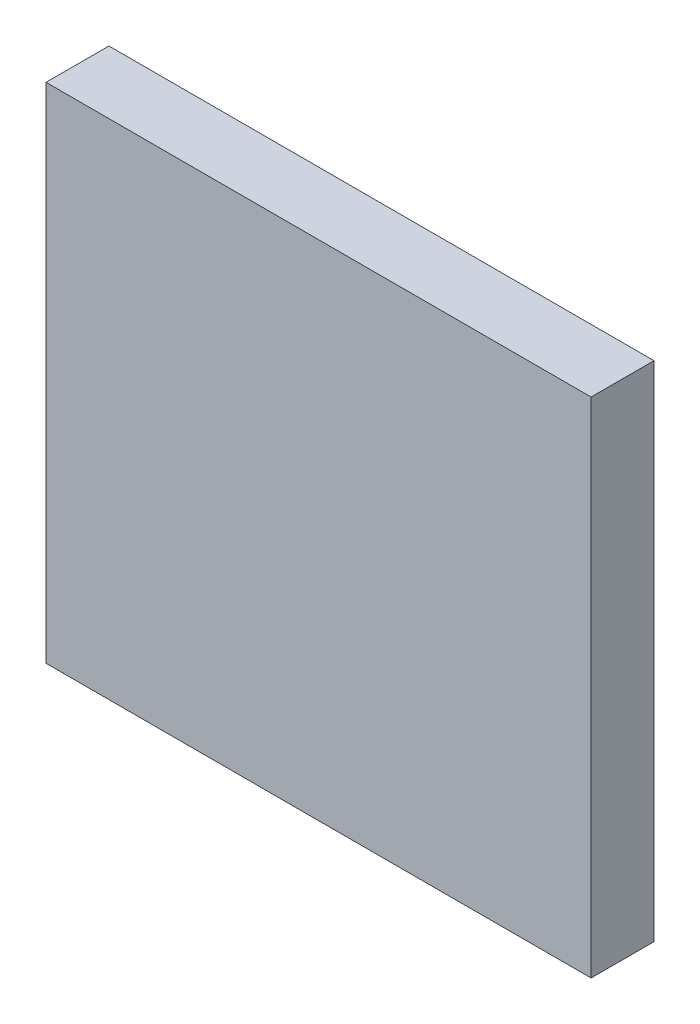
ISO-10303-21;
HEADER;
FILE_DESCRIPTION(('STEP AP214'),'2;1');
FILE_NAME('part.step','',(''),(''),'','','');
FILE_SCHEMA(('AUTOMOTIVE_DESIGN { 1 0 10303 214 1 1 1 1 }'));
ENDSEC;
DATA;
#1=APPLICATION_CONTEXT('core data for automotive mechanical design processes');
#2=APPLICATION_PROTOCOL_DEFINITION('international standard','automotive_design',2000,#1);
#3=PRODUCT_CONTEXT('',#1,'mechanical');
#4=PRODUCT('Part','Part','',(#3));
#5=PRODUCT_RELATED_PRODUCT_CATEGORY('part','',(#4));
#6=PRODUCT_DEFINITION_FORMATION('','',#4);
#7=PRODUCT_DEFINITION_CONTEXT('part definition',#1,'design');
#8=PRODUCT_DEFINITION('design','',#6,#7);
#9=PRODUCT_DEFINITION_SHAPE('','',#8);
#10=(LENGTH_UNIT() NAMED_UNIT(*) SI_UNIT(.MILLI.,.METRE.));
#11=(NAMED_UNIT(*) PLANE_ANGLE_UNIT() SI_UNIT($,.RADIAN.));
#12=(NAMED_UNIT(*) SI_UNIT($,.STERADIAN.) SOLID_ANGLE_UNIT());
#13=UNCERTAINTY_MEASURE_WITH_UNIT(LENGTH_MEASURE(1.E-05),#10,'distance_accuracy_value','');
#14=(GEOMETRIC_REPRESENTATION_CONTEXT(3) GLOBAL_UNCERTAINTY_ASSIGNED_CONTEXT((#13)) GLOBAL_UNIT_ASSIGNED_CONTEXT((#10,
#11,#12)) REPRESENTATION_CONTEXT('',''));
#15=CARTESIAN_POINT('',(0.,0.,0.));
#16=DIRECTION('',(0.,0.,1.));
#17=DIRECTION('',(1.,0.,0.));
#18=AXIS2_PLACEMENT_3D('',#15,#16,#17);
#19=CARTESIAN_POINT('',(13.,-12.,3.));
#20=DIRECTION('',(-1.,0.,0.));
#21=DIRECTION('',(0.,0.,1.));
#22=AXIS2_PLACEMENT_3D('',#19,#20,#21);
#23=PLANE('',#22);
#24=DIRECTION('',(0.,1.,0.));
#25=VECTOR('',#24,1.);
#26=CARTESIAN_POINT('',(13.,-12.,0.));
#27=LINE('',#26,#25);
#28=CARTESIAN_POINT('',(13.,-12.,0.));
#29=VERTEX_POINT('',#28);
#30=CARTESIAN_POINT('',(13.,12.,0.));
#31=VERTEX_POINT('',#30);
#32=EDGE_CURVE('E96',#29,#31,#27,.T.);
#33=ORIENTED_EDGE('',*,*,#32,.T.);
#34=DIRECTION('',(0.,0.,-1.));
#35=VECTOR('',#34,1.);
#36=CARTESIAN_POINT('',(13.,12.,3.));
#37=LINE('',#36,#35);
#38=CARTESIAN_POINT('',(13.,12.,3.));
#39=VERTEX_POINT('',#38);
#40=EDGE_CURVE('E11',#39,#31,#37,.T.);
#41=ORIENTED_EDGE('',*,*,#40,.F.);
#42=DIRECTION('',(0.,1.,0.));
#43=VECTOR('',#42,1.);
#44=CARTESIAN_POINT('',(13.,-12.,3.));
#45=LINE('',#44,#43);
#46=CARTESIAN_POINT('',(13.,-12.,3.));
#47=VERTEX_POINT('',#46);
#48=EDGE_CURVE('E84',#47,#39,#45,.T.);
#49=ORIENTED_EDGE('',*,*,#48,.F.);
#50=DIRECTION('',(0.,0.,-1.));
#51=VECTOR('',#50,1.);
#52=CARTESIAN_POINT('',(13.,-12.,3.));
#53=LINE('',#52,#51);
#54=EDGE_CURVE('E92',#47,#29,#53,.T.);
#55=ORIENTED_EDGE('',*,*,#54,.T.);
#56=EDGE_LOOP('',(#33,#41,#49,#55));
#57=FACE_BOUND('',#56,.T.);
#58=ADVANCED_FACE('F33',(#57),#23,.F.);
#59=CARTESIAN_POINT('',(-13.,12.,3.));
#60=DIRECTION('',(0.,-1.,0.));
#61=DIRECTION('',(0.,0.,-1.));
#62=AXIS2_PLACEMENT_3D('',#59,#60,#61);
#63=PLANE('',#62);
#64=DIRECTION('',(-1.,0.,0.));
#65=VECTOR('',#64,1.);
#66=CARTESIAN_POINT('',(-13.,12.,0.));
#67=LINE('',#66,#65);
#68=CARTESIAN_POINT('',(-13.,12.,0.));
#69=VERTEX_POINT('',#68);
#70=EDGE_CURVE('E88',#31,#69,#67,.T.);
#71=ORIENTED_EDGE('',*,*,#70,.T.);
#72=DIRECTION('',(0.,0.,-1.));
#73=VECTOR('',#72,1.);
#74=CARTESIAN_POINT('',(-13.,12.,3.));
#75=LINE('',#74,#73);
#76=CARTESIAN_POINT('',(-13.,12.,3.));
#77=VERTEX_POINT('',#76);
#78=EDGE_CURVE('E41',#77,#69,#75,.T.);
#79=ORIENTED_EDGE('',*,*,#78,.F.);
#80=DIRECTION('',(-1.,0.,0.));
#81=VECTOR('',#80,1.);
#82=CARTESIAN_POINT('',(-13.,12.,3.));
#83=LINE('',#82,#81);
#84=EDGE_CURVE('E79',#39,#77,#83,.T.);
#85=ORIENTED_EDGE('',*,*,#84,.F.);
#86=ORIENTED_EDGE('',*,*,#40,.T.);
#87=EDGE_LOOP('',(#71,#79,#85,#86));
#88=FACE_BOUND('',#87,.T.);
#89=ADVANCED_FACE('F87',(#88),#63,.F.);
#90=CARTESIAN_POINT('',(-13.,-12.,3.));
#91=DIRECTION('',(1.,0.,0.));
#92=DIRECTION('',(0.,0.,-1.));
#93=AXIS2_PLACEMENT_3D('',#90,#91,#92);
#94=PLANE('',#93);
#95=DIRECTION('',(0.,-1.,0.));
#96=VECTOR('',#95,1.);
#97=CARTESIAN_POINT('',(-13.,-12.,0.));
#98=LINE('',#97,#96);
#99=CARTESIAN_POINT('',(-13.,-12.,0.));
#100=VERTEX_POINT('',#99);
#101=EDGE_CURVE('E66',#69,#100,#98,.T.);
#102=ORIENTED_EDGE('',*,*,#101,.T.);
#103=DIRECTION('',(0.,0.,-1.));
#104=VECTOR('',#103,1.);
#105=CARTESIAN_POINT('',(-13.,-12.,3.));
#106=LINE('',#105,#104);
#107=CARTESIAN_POINT('',(-13.,-12.,3.));
#108=VERTEX_POINT('',#107);
#109=EDGE_CURVE('E89',#108,#100,#106,.T.);
#110=ORIENTED_EDGE('',*,*,#109,.F.);
#111=DIRECTION('',(0.,-1.,0.));
#112=VECTOR('',#111,1.);
#113=CARTESIAN_POINT('',(-13.,-12.,3.));
#114=LINE('',#113,#112);
#115=EDGE_CURVE('E82',#77,#108,#114,.T.);
#116=ORIENTED_EDGE('',*,*,#115,.F.);
#117=ORIENTED_EDGE('',*,*,#78,.T.);
#118=EDGE_LOOP('',(#102,#110,#116,#117));
#119=FACE_BOUND('',#118,.T.);
#120=ADVANCED_FACE('F90',(#119),#94,.F.);
#121=CARTESIAN_POINT('',(-13.,-12.,3.));
#122=DIRECTION('',(0.,1.,0.));
#123=DIRECTION('',(0.,0.,1.));
#124=AXIS2_PLACEMENT_3D('',#121,#122,#123);
#125=PLANE('',#124);
#126=DIRECTION('',(1.,0.,0.));
#127=VECTOR('',#126,1.);
#128=CARTESIAN_POINT('',(-13.,-12.,0.));
#129=LINE('',#128,#127);
#130=EDGE_CURVE('E72',#100,#29,#129,.T.);
#131=ORIENTED_EDGE('',*,*,#130,.T.);
#132=ORIENTED_EDGE('',*,*,#54,.F.);
#133=DIRECTION('',(1.,0.,0.));
#134=VECTOR('',#133,1.);
#135=CARTESIAN_POINT('',(-13.,-12.,3.));
#136=LINE('',#135,#134);
#137=EDGE_CURVE('E49',#108,#47,#136,.T.);
#138=ORIENTED_EDGE('',*,*,#137,.F.);
#139=ORIENTED_EDGE('',*,*,#109,.T.);
#140=EDGE_LOOP('',(#131,#132,#138,#139));
#141=FACE_BOUND('',#140,.T.);
#142=ADVANCED_FACE('F103',(#141),#125,.F.);
#143=CARTESIAN_POINT('',(0.,0.,3.));
#144=DIRECTION('',(0.,0.,-1.));
#145=DIRECTION('',(-1.,0.,0.));
#146=AXIS2_PLACEMENT_3D('',#143,#144,#145);
#147=PLANE('',#146);
#148=ORIENTED_EDGE('',*,*,#48,.T.);
#149=ORIENTED_EDGE('',*,*,#84,.T.);
#150=ORIENTED_EDGE('',*,*,#115,.T.);
#151=ORIENTED_EDGE('',*,*,#137,.T.);
#152=EDGE_LOOP('',(#148,#149,#150,#151));
#153=FACE_BOUND('',#152,.T.);
#154=ADVANCED_FACE('F80',(#153),#147,.F.);
#155=CARTESIAN_POINT('',(0.,0.,0.));
#156=DIRECTION('',(0.,0.,-1.));
#157=DIRECTION('',(-1.,0.,0.));
#158=AXIS2_PLACEMENT_3D('',#155,#156,#157);
#159=PLANE('',#158);
#160=ORIENTED_EDGE('',*,*,#32,.F.);
#161=ORIENTED_EDGE('',*,*,#130,.F.);
#162=ORIENTED_EDGE('',*,*,#101,.F.);
#163=ORIENTED_EDGE('',*,*,#70,.F.);
#164=EDGE_LOOP('',(#160,#161,#162,#163));
#165=FACE_BOUND('',#164,.T.);
#166=ADVANCED_FACE('F106',(#165),#159,.T.);
#167=CLOSED_SHELL('',(#58,#89,#120,#142,#154,#166));
#168=MANIFOLD_SOLID_BREP('B2',#167);
#169=ADVANCED_BREP_SHAPE_REPRESENTATION('',(#18,#168),#14);
#170=SHAPE_DEFINITION_REPRESENTATION(#9,#169);
ENDSEC;
END-ISO-10303-21;
